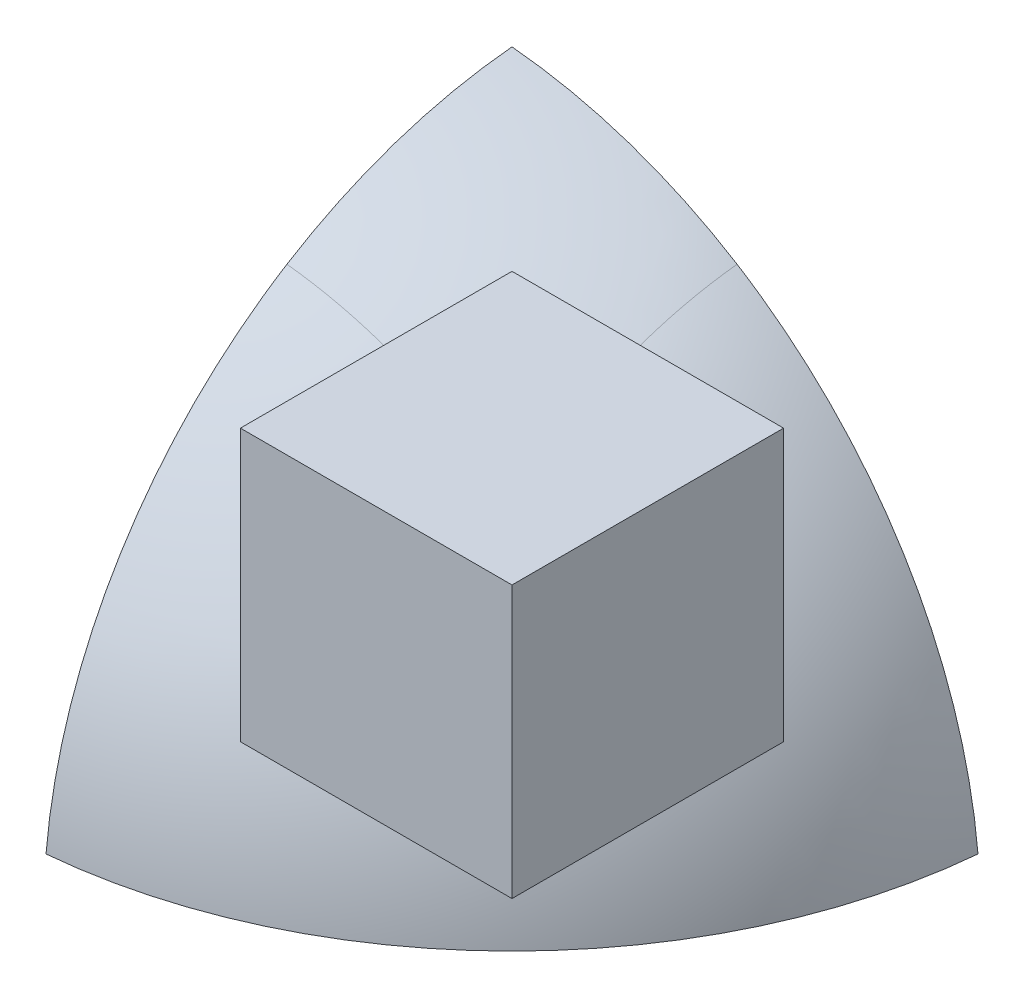
ISO-10303-21;
HEADER;
FILE_DESCRIPTION(('STEP AP214'),'2;1');
FILE_NAME('part.step','',(''),(''),'','','');
FILE_SCHEMA(('AUTOMOTIVE_DESIGN { 1 0 10303 214 1 1 1 1 }'));
ENDSEC;
DATA;
#1=APPLICATION_CONTEXT('core data for automotive mechanical design processes');
#2=APPLICATION_PROTOCOL_DEFINITION('international standard','automotive_design',2000,#1);
#3=PRODUCT_CONTEXT('',#1,'mechanical');
#4=PRODUCT('Part','Part','',(#3));
#5=PRODUCT_RELATED_PRODUCT_CATEGORY('part','',(#4));
#6=PRODUCT_DEFINITION_FORMATION('','',#4);
#7=PRODUCT_DEFINITION_CONTEXT('part definition',#1,'design');
#8=PRODUCT_DEFINITION('design','',#6,#7);
#9=PRODUCT_DEFINITION_SHAPE('','',#8);
#10=(LENGTH_UNIT() NAMED_UNIT(*) SI_UNIT(.MILLI.,.METRE.));
#11=(NAMED_UNIT(*) PLANE_ANGLE_UNIT() SI_UNIT($,.RADIAN.));
#12=(NAMED_UNIT(*) SI_UNIT($,.STERADIAN.) SOLID_ANGLE_UNIT());
#13=UNCERTAINTY_MEASURE_WITH_UNIT(LENGTH_MEASURE(1.E-05),#10,'distance_accuracy_value','');
#14=(GEOMETRIC_REPRESENTATION_CONTEXT(3) GLOBAL_UNCERTAINTY_ASSIGNED_CONTEXT((#13)) GLOBAL_UNIT_ASSIGNED_CONTEXT((#10,
#11,#12)) REPRESENTATION_CONTEXT('',''));
#15=CARTESIAN_POINT('',(0.,0.,0.));
#16=DIRECTION('',(0.,0.,1.));
#17=DIRECTION('',(1.,0.,0.));
#18=AXIS2_PLACEMENT_3D('',#15,#16,#17);
#19=CARTESIAN_POINT('',(23.6228742735545,0.,2.36043317420627));
#20=DIRECTION('',(0.,0.,1.));
#21=DIRECTION('',(0.,-1.,0.));
#22=AXIS2_PLACEMENT_3D('',#19,#20,#21);
#23=PLANE('',#22);
#24=CARTESIAN_POINT('',(0.,0.,2.36043317420627));
#25=DIRECTION('',(0.,0.,1.));
#26=DIRECTION('',(0.,-1.,0.));
#27=AXIS2_PLACEMENT_3D('',#24,#25,#26);
#28=CIRCLE('',#27,23.6228742735545);
#29=CARTESIAN_POINT('',(23.5046494161106,2.36043317420627,2.36043317420628));
#30=VERTEX_POINT('',#29);
#31=CARTESIAN_POINT('',(2.36043317420619,23.5046494161106,2.36043317420635));
#32=VERTEX_POINT('',#31);
#33=EDGE_CURVE('E78',#30,#32,#28,.T.);
#34=ORIENTED_EDGE('',*,*,#33,.T.);
#35=DIRECTION('',(0.,1.,0.));
#36=VECTOR('',#35,1.);
#37=CARTESIAN_POINT('',(2.36043317420627,0.,2.36043317420627));
#38=LINE('',#37,#36);
#39=CARTESIAN_POINT('',(2.36043317420618,25.5231382424998,2.36043317420636));
#40=VERTEX_POINT('',#39);
#41=EDGE_CURVE('E154',#32,#40,#38,.T.);
#42=ORIENTED_EDGE('',*,*,#41,.T.);
#43=CARTESIAN_POINT('',(0.,0.,2.36043317420627));
#44=DIRECTION('',(0.,0.,-1.));
#45=DIRECTION('',(0.,1.,0.));
#46=AXIS2_PLACEMENT_3D('',#43,#44,#45);
#47=CIRCLE('',#46,25.6320547462674);
#48=CARTESIAN_POINT('',(13.5486364278668,21.7586001723716,2.36043317420635));
#49=VERTEX_POINT('',#48);
#50=EDGE_CURVE('E156',#40,#49,#47,.T.);
#51=ORIENTED_EDGE('',*,*,#50,.T.);
#52=CARTESIAN_POINT('',(0.,0.,2.36043317420627));
#53=DIRECTION('',(0.,0.,-1.));
#54=DIRECTION('',(0.,1.,0.));
#55=AXIS2_PLACEMENT_3D('',#52,#53,#54);
#56=CIRCLE('',#55,25.6320547462674);
#57=CARTESIAN_POINT('',(25.5231382424998,2.36043317420627,2.36043317420628));
#58=VERTEX_POINT('',#57);
#59=EDGE_CURVE('E60',#58,#49,#56,.F.);
#60=ORIENTED_EDGE('',*,*,#59,.F.);
#61=DIRECTION('',(-1.,0.,0.));
#62=VECTOR('',#61,1.);
#63=CARTESIAN_POINT('',(25.6320547462674,2.36043317420627,2.36043317420628));
#64=LINE('',#63,#62);
#65=EDGE_CURVE('E142',#58,#30,#64,.T.);
#66=ORIENTED_EDGE('',*,*,#65,.T.);
#67=EDGE_LOOP('',(#34,#42,#51,#60,#66));
#68=FACE_BOUND('',#67,.T.);
#69=ADVANCED_FACE('F41',(#68),#23,.F.);
#70=CARTESIAN_POINT('',(2.36043317420619,23.6228742735545,0.));
#71=DIRECTION('',(1.,0.,0.));
#72=DIRECTION('',(0.,0.,1.));
#73=AXIS2_PLACEMENT_3D('',#70,#71,#72);
#74=PLANE('',#73);
#75=CARTESIAN_POINT('',(2.36043317420627,0.,0.));
#76=DIRECTION('',(1.,0.,0.));
#77=DIRECTION('',(0.,1.,0.));
#78=AXIS2_PLACEMENT_3D('',#75,#76,#77);
#79=CIRCLE('',#78,23.6228742735545);
#80=CARTESIAN_POINT('',(2.36043317420626,2.36043317420627,23.5046494161106));
#81=VERTEX_POINT('',#80);
#82=EDGE_CURVE('E119',#32,#81,#79,.T.);
#83=ORIENTED_EDGE('',*,*,#82,.T.);
#84=DIRECTION('',(0.,0.,1.));
#85=VECTOR('',#84,1.);
#86=CARTESIAN_POINT('',(2.36043317420626,2.36043317420627,0.));
#87=LINE('',#86,#85);
#88=CARTESIAN_POINT('',(2.36043317420626,2.36043317420627,25.5231382424998));
#89=VERTEX_POINT('',#88);
#90=EDGE_CURVE('E127',#81,#89,#87,.T.);
#91=ORIENTED_EDGE('',*,*,#90,.T.);
#92=CARTESIAN_POINT('',(2.36043317420627,0.,0.));
#93=DIRECTION('',(1.,0.,0.));
#94=DIRECTION('',(0.,0.,-1.));
#95=AXIS2_PLACEMENT_3D('',#92,#93,#94);
#96=CIRCLE('',#95,25.6320547462674);
#97=CARTESIAN_POINT('',(2.36043317420619,21.7586001723716,13.5486364278669));
#98=VERTEX_POINT('',#97);
#99=EDGE_CURVE('E122',#98,#89,#96,.T.);
#100=ORIENTED_EDGE('',*,*,#99,.F.);
#101=CARTESIAN_POINT('',(2.36043317420627,0.,0.));
#102=DIRECTION('',(1.,0.,0.));
#103=DIRECTION('',(0.,1.,0.));
#104=AXIS2_PLACEMENT_3D('',#101,#102,#103);
#105=CIRCLE('',#104,25.6320547462674);
#106=EDGE_CURVE('E158',#98,#40,#105,.F.);
#107=ORIENTED_EDGE('',*,*,#106,.T.);
#108=ORIENTED_EDGE('',*,*,#41,.F.);
#109=EDGE_LOOP('',(#83,#91,#100,#107,#108));
#110=FACE_BOUND('',#109,.T.);
#111=ADVANCED_FACE('F251',(#110),#74,.F.);
#112=CARTESIAN_POINT('',(27.6399036193533,2.36043317420627,0.));
#113=DIRECTION('',(0.,-1.,0.));
#114=DIRECTION('',(0.,0.,-1.));
#115=AXIS2_PLACEMENT_3D('',#112,#113,#114);
#116=PLANE('',#115);
#117=CARTESIAN_POINT('',(0.,2.36043317420627,0.));
#118=DIRECTION('',(0.,-1.,0.));
#119=DIRECTION('',(0.,0.,-1.));
#120=AXIS2_PLACEMENT_3D('',#117,#118,#119);
#121=CIRCLE('',#120,23.6228742735545);
#122=EDGE_CURVE('E98',#30,#81,#121,.T.);
#123=ORIENTED_EDGE('',*,*,#122,.F.);
#124=ORIENTED_EDGE('',*,*,#65,.F.);
#125=CARTESIAN_POINT('',(0.,2.36043317420627,0.));
#126=DIRECTION('',(0.,-1.,0.));
#127=DIRECTION('',(0.,0.,-1.));
#128=AXIS2_PLACEMENT_3D('',#125,#126,#127);
#129=CIRCLE('',#128,25.6320547462674);
#130=EDGE_CURVE('E108',#58,#89,#129,.T.);
#131=ORIENTED_EDGE('',*,*,#130,.T.);
#132=ORIENTED_EDGE('',*,*,#90,.F.);
#133=EDGE_LOOP('',(#123,#124,#131,#132));
#134=FACE_BOUND('',#133,.T.);
#135=ADVANCED_FACE('F250',(#134),#116,.T.);
#136=CARTESIAN_POINT('',(0.,0.,0.));
#137=DIRECTION('',(0.,-1.,0.));
#138=DIRECTION('',(1.,0.,0.));
#139=AXIS2_PLACEMENT_3D('',#136,#137,#138);
#140=SPHERICAL_SURFACE('',#139,25.7405103928719);
#141=ORIENTED_EDGE('',*,*,#59,.T.);
#142=CARTESIAN_POINT('',(13.5486364278669,0.,0.));
#143=DIRECTION('',(1.,0.,0.));
#144=DIRECTION('',(0.,0.,-1.));
#145=AXIS2_PLACEMENT_3D('',#142,#143,#144);
#146=CIRCLE('',#145,21.8862588450156);
#147=CARTESIAN_POINT('',(13.5486364278668,17.188448946211,13.5486364278669));
#148=VERTEX_POINT('',#147);
#149=EDGE_CURVE('E131',#49,#148,#146,.T.);
#150=ORIENTED_EDGE('',*,*,#149,.T.);
#151=CARTESIAN_POINT('',(0.,0.,13.5486364278669));
#152=DIRECTION('',(0.,0.,-1.));
#153=DIRECTION('',(0.,1.,0.));
#154=AXIS2_PLACEMENT_3D('',#151,#152,#153);
#155=CIRCLE('',#154,21.8862588450156);
#156=CARTESIAN_POINT('',(17.188448946211,13.5486364278669,13.5486364278669));
#157=VERTEX_POINT('',#156);
#158=EDGE_CURVE('E133',#148,#157,#155,.T.);
#159=ORIENTED_EDGE('',*,*,#158,.T.);
#160=CARTESIAN_POINT('',(0.,13.5486364278669,0.));
#161=DIRECTION('',(0.,-1.,0.));
#162=DIRECTION('',(0.,0.,-1.));
#163=AXIS2_PLACEMENT_3D('',#160,#161,#162);
#164=CIRCLE('',#163,21.8862588450156);
#165=CARTESIAN_POINT('',(13.5486364278668,13.5486364278669,17.188448946211));
#166=VERTEX_POINT('',#165);
#167=EDGE_CURVE('E137',#157,#166,#164,.T.);
#168=ORIENTED_EDGE('',*,*,#167,.T.);
#169=EDGE_CURVE('E51',#148,#166,#146,.T.);
#170=ORIENTED_EDGE('',*,*,#169,.F.);
#171=EDGE_CURVE('E117',#98,#148,#155,.T.);
#172=ORIENTED_EDGE('',*,*,#171,.F.);
#173=ORIENTED_EDGE('',*,*,#99,.T.);
#174=ORIENTED_EDGE('',*,*,#130,.F.);
#175=EDGE_LOOP('',(#141,#150,#159,#168,#170,#172,#173,#174));
#176=FACE_BOUND('',#175,.T.);
#177=ADVANCED_FACE('F213',(#176),#140,.T.);
#178=CARTESIAN_POINT('',(0.,0.,0.));
#179=DIRECTION('',(0.,0.,-1.));
#180=DIRECTION('',(1.,0.,0.));
#181=AXIS2_PLACEMENT_3D('',#178,#179,#180);
#182=SPHERICAL_SURFACE('',#181,25.7405103928719);
#183=ORIENTED_EDGE('',*,*,#149,.F.);
#184=ORIENTED_EDGE('',*,*,#50,.F.);
#185=ORIENTED_EDGE('',*,*,#106,.F.);
#186=ORIENTED_EDGE('',*,*,#171,.T.);
#187=EDGE_LOOP('',(#183,#184,#185,#186));
#188=FACE_BOUND('',#187,.T.);
#189=ADVANCED_FACE('F221',(#188),#182,.T.);
#190=CARTESIAN_POINT('',(32.4999999999999,19.5000000000001,0.));
#191=DIRECTION('',(0.,-1.,0.));
#192=DIRECTION('',(0.,0.,-1.));
#193=AXIS2_PLACEMENT_3D('',#190,#191,#192);
#194=PLANE('',#193);
#195=DIRECTION('',(0.,0.,-1.));
#196=VECTOR('',#195,1.);
#197=CARTESIAN_POINT('',(33.,19.5000000000001,-33.));
#198=LINE('',#197,#196);
#199=CARTESIAN_POINT('',(33.,19.5000000000001,33.));
#200=VERTEX_POINT('',#199);
#201=CARTESIAN_POINT('',(33.,19.5,19.5000000000001));
#202=VERTEX_POINT('',#201);
#203=EDGE_CURVE('E186',#200,#202,#198,.T.);
#204=ORIENTED_EDGE('',*,*,#203,.F.);
#205=DIRECTION('',(-1.,0.,0.));
#206=VECTOR('',#205,1.);
#207=CARTESIAN_POINT('',(0.,19.5000000000001,33.));
#208=LINE('',#207,#206);
#209=CARTESIAN_POINT('',(19.5,19.5000000000001,33.));
#210=VERTEX_POINT('',#209);
#211=EDGE_CURVE('E107',#200,#210,#208,.T.);
#212=ORIENTED_EDGE('',*,*,#211,.T.);
#213=DIRECTION('',(0.,0.,-1.));
#214=VECTOR('',#213,1.);
#215=CARTESIAN_POINT('',(19.5,19.5000000000001,0.));
#216=LINE('',#215,#214);
#217=CARTESIAN_POINT('',(19.5,19.5,24.7386337537059));
#218=VERTEX_POINT('',#217);
#219=EDGE_CURVE('E150',#210,#218,#216,.T.);
#220=ORIENTED_EDGE('',*,*,#219,.T.);
#221=CARTESIAN_POINT('',(0.,19.5,0.));
#222=DIRECTION('',(0.,-1.,0.));
#223=DIRECTION('',(0.,0.,-1.));
#224=AXIS2_PLACEMENT_3D('',#221,#222,#223);
#225=CIRCLE('',#224,31.4999999999999);
#226=CARTESIAN_POINT('',(24.7386337537058,19.5,19.5000000000001));
#227=VERTEX_POINT('',#226);
#228=EDGE_CURVE('E134',#227,#218,#225,.T.);
#229=ORIENTED_EDGE('',*,*,#228,.F.);
#230=DIRECTION('',(1.,0.,0.));
#231=VECTOR('',#230,1.);
#232=CARTESIAN_POINT('',(32.4999999999999,19.5000000000001,19.5000000000001));
#233=LINE('',#232,#231);
#234=EDGE_CURVE('E151',#227,#202,#233,.T.);
#235=ORIENTED_EDGE('',*,*,#234,.T.);
#236=EDGE_LOOP('',(#204,#212,#220,#229,#235));
#237=FACE_BOUND('',#236,.T.);
#238=ADVANCED_FACE('F197',(#237),#194,.T.);
#239=CARTESIAN_POINT('',(19.4999999999999,32.5,0.));
#240=DIRECTION('',(-1.,0.,0.));
#241=DIRECTION('',(0.,0.,-1.));
#242=AXIS2_PLACEMENT_3D('',#239,#240,#241);
#243=PLANE('',#242);
#244=DIRECTION('',(0.,0.,1.));
#245=VECTOR('',#244,1.);
#246=CARTESIAN_POINT('',(19.4999999999999,33.,-33.));
#247=LINE('',#246,#245);
#248=CARTESIAN_POINT('',(19.5,33.,19.5000000000002));
#249=VERTEX_POINT('',#248);
#250=CARTESIAN_POINT('',(19.5,33.,33.));
#251=VERTEX_POINT('',#250);
#252=EDGE_CURVE('E112',#249,#251,#247,.T.);
#253=ORIENTED_EDGE('',*,*,#252,.F.);
#254=DIRECTION('',(0.,1.,0.));
#255=VECTOR('',#254,1.);
#256=CARTESIAN_POINT('',(19.5000000000001,-1.13473143512402E-13,19.5000000000001));
#257=LINE('',#256,#255);
#258=CARTESIAN_POINT('',(19.5,24.7386337537058,19.5000000000001));
#259=VERTEX_POINT('',#258);
#260=EDGE_CURVE('E169',#259,#249,#257,.T.);
#261=ORIENTED_EDGE('',*,*,#260,.F.);
#262=CARTESIAN_POINT('',(19.5,0.,0.));
#263=DIRECTION('',(1.,0.,0.));
#264=DIRECTION('',(0.,0.,-1.));
#265=AXIS2_PLACEMENT_3D('',#262,#263,#264);
#266=CIRCLE('',#265,31.4999999999999);
#267=EDGE_CURVE('E11',#259,#218,#266,.T.);
#268=ORIENTED_EDGE('',*,*,#267,.T.);
#269=ORIENTED_EDGE('',*,*,#219,.F.);
#270=DIRECTION('',(0.,1.,0.));
#271=VECTOR('',#270,1.);
#272=CARTESIAN_POINT('',(19.5000000000001,0.,33.));
#273=LINE('',#272,#271);
#274=EDGE_CURVE('E185',#210,#251,#273,.T.);
#275=ORIENTED_EDGE('',*,*,#274,.T.);
#276=EDGE_LOOP('',(#253,#261,#268,#269,#275));
#277=FACE_BOUND('',#276,.T.);
#278=ADVANCED_FACE('F268',(#277),#243,.T.);
#279=CARTESIAN_POINT('',(0.,13.5486364278669,0.));
#280=DIRECTION('',(0.,1.,0.));
#281=DIRECTION('',(0.,0.,1.));
#282=AXIS2_PLACEMENT_3D('',#279,#280,#281);
#283=CONICAL_SURFACE('',#282,21.8862588450156,1.01648883059334);
#284=ORIENTED_EDGE('',*,*,#228,.T.);
#285=DIRECTION('',(0.526354614616295,0.526354614616297,0.667758668490542));
#286=VECTOR('',#285,1.);
#287=CARTESIAN_POINT('',(0.,0.,0.));
#288=LINE('',#287,#286);
#289=EDGE_CURVE('E146',#218,#166,#288,.F.);
#290=ORIENTED_EDGE('',*,*,#289,.T.);
#291=ORIENTED_EDGE('',*,*,#167,.F.);
#292=DIRECTION('',(0.667758668490539,0.526354614616297,0.526354614616299));
#293=VECTOR('',#292,1.);
#294=CARTESIAN_POINT('',(0.,0.,0.));
#295=LINE('',#294,#293);
#296=EDGE_CURVE('E147',#157,#227,#295,.T.);
#297=ORIENTED_EDGE('',*,*,#296,.T.);
#298=EDGE_LOOP('',(#284,#290,#291,#297));
#299=FACE_BOUND('',#298,.T.);
#300=ADVANCED_FACE('F208',(#299),#283,.T.);
#301=CARTESIAN_POINT('',(32.4999999999999,0.,19.5000000000001));
#302=DIRECTION('',(0.,0.,-1.));
#303=DIRECTION('',(0.,1.,0.));
#304=AXIS2_PLACEMENT_3D('',#301,#302,#303);
#305=PLANE('',#304);
#306=DIRECTION('',(0.,1.,0.));
#307=VECTOR('',#306,1.);
#308=CARTESIAN_POINT('',(33.,-33.0000000000002,19.4999999999999));
#309=LINE('',#308,#307);
#310=CARTESIAN_POINT('',(33.,33.,19.5000000000002));
#311=VERTEX_POINT('',#310);
#312=EDGE_CURVE('E93',#202,#311,#309,.T.);
#313=ORIENTED_EDGE('',*,*,#312,.F.);
#314=ORIENTED_EDGE('',*,*,#234,.F.);
#315=CARTESIAN_POINT('',(0.,0.,19.5));
#316=DIRECTION('',(0.,0.,-1.));
#317=DIRECTION('',(0.,1.,0.));
#318=AXIS2_PLACEMENT_3D('',#315,#316,#317);
#319=CIRCLE('',#318,31.4999999999999);
#320=EDGE_CURVE('E126',#259,#227,#319,.T.);
#321=ORIENTED_EDGE('',*,*,#320,.F.);
#322=ORIENTED_EDGE('',*,*,#260,.T.);
#323=DIRECTION('',(-1.,0.,0.));
#324=VECTOR('',#323,1.);
#325=CARTESIAN_POINT('',(-33.,33.,19.5000000000002));
#326=LINE('',#325,#324);
#327=EDGE_CURVE('E182',#311,#249,#326,.T.);
#328=ORIENTED_EDGE('',*,*,#327,.F.);
#329=EDGE_LOOP('',(#313,#314,#321,#322,#328));
#330=FACE_BOUND('',#329,.T.);
#331=ADVANCED_FACE('F239',(#330),#305,.T.);
#332=CARTESIAN_POINT('',(13.5486364278669,0.,0.));
#333=DIRECTION('',(1.,0.,0.));
#334=DIRECTION('',(0.,0.,1.));
#335=AXIS2_PLACEMENT_3D('',#332,#333,#334);
#336=CONICAL_SURFACE('',#335,21.8862588450156,1.01648883059334);
#337=ORIENTED_EDGE('',*,*,#289,.F.);
#338=ORIENTED_EDGE('',*,*,#267,.F.);
#339=DIRECTION('',(0.526354614616295,0.66775866849054,0.526354614616299));
#340=VECTOR('',#339,1.);
#341=CARTESIAN_POINT('',(0.,0.,0.));
#342=LINE('',#341,#340);
#343=EDGE_CURVE('E45',#148,#259,#342,.T.);
#344=ORIENTED_EDGE('',*,*,#343,.F.);
#345=ORIENTED_EDGE('',*,*,#169,.T.);
#346=EDGE_LOOP('',(#337,#338,#344,#345));
#347=FACE_BOUND('',#346,.T.);
#348=ADVANCED_FACE('F203',(#347),#336,.T.);
#349=CARTESIAN_POINT('',(0.,0.,13.5486364278669));
#350=DIRECTION('',(0.,0.,1.));
#351=DIRECTION('',(0.,-1.,0.));
#352=AXIS2_PLACEMENT_3D('',#349,#350,#351);
#353=CONICAL_SURFACE('',#352,21.8862588450156,1.01648883059334);
#354=ORIENTED_EDGE('',*,*,#296,.F.);
#355=ORIENTED_EDGE('',*,*,#158,.F.);
#356=ORIENTED_EDGE('',*,*,#343,.T.);
#357=ORIENTED_EDGE('',*,*,#320,.T.);
#358=EDGE_LOOP('',(#354,#355,#356,#357));
#359=FACE_BOUND('',#358,.T.);
#360=ADVANCED_FACE('F265',(#359),#353,.T.);
#361=CARTESIAN_POINT('',(0.,0.,0.));
#362=DIRECTION('',(-1.,0.,0.));
#363=DIRECTION('',(0.,1.,0.));
#364=AXIS2_PLACEMENT_3D('',#361,#362,#363);
#365=SPHERICAL_SURFACE('',#364,23.7405103928718);
#366=ORIENTED_EDGE('',*,*,#82,.F.);
#367=ORIENTED_EDGE('',*,*,#33,.F.);
#368=ORIENTED_EDGE('',*,*,#122,.T.);
#369=EDGE_LOOP('',(#366,#367,#368));
#370=FACE_BOUND('',#369,.T.);
#371=ADVANCED_FACE('F247',(#370),#365,.F.);
#372=CARTESIAN_POINT('',(-33.,33.,-33.));
#373=DIRECTION('',(0.,1.,0.));
#374=DIRECTION('',(0.,0.,1.));
#375=AXIS2_PLACEMENT_3D('',#372,#373,#374);
#376=PLANE('',#375);
#377=DIRECTION('',(0.,0.,1.));
#378=VECTOR('',#377,1.);
#379=CARTESIAN_POINT('',(33.,33.,-33.));
#380=LINE('',#379,#378);
#381=CARTESIAN_POINT('',(33.,33.,33.));
#382=VERTEX_POINT('',#381);
#383=EDGE_CURVE('E85',#311,#382,#380,.T.);
#384=ORIENTED_EDGE('',*,*,#383,.F.);
#385=ORIENTED_EDGE('',*,*,#327,.T.);
#386=ORIENTED_EDGE('',*,*,#252,.T.);
#387=DIRECTION('',(-1.,0.,0.));
#388=VECTOR('',#387,1.);
#389=CARTESIAN_POINT('',(-33.,33.,33.));
#390=LINE('',#389,#388);
#391=EDGE_CURVE('E97',#382,#251,#390,.T.);
#392=ORIENTED_EDGE('',*,*,#391,.F.);
#393=EDGE_LOOP('',(#384,#385,#386,#392));
#394=FACE_BOUND('',#393,.T.);
#395=ADVANCED_FACE('F110',(#394),#376,.T.);
#396=CARTESIAN_POINT('',(33.,-33.,-33.));
#397=DIRECTION('',(1.,0.,0.));
#398=DIRECTION('',(0.,0.,-1.));
#399=AXIS2_PLACEMENT_3D('',#396,#397,#398);
#400=PLANE('',#399);
#401=ORIENTED_EDGE('',*,*,#203,.T.);
#402=ORIENTED_EDGE('',*,*,#312,.T.);
#403=ORIENTED_EDGE('',*,*,#383,.T.);
#404=DIRECTION('',(0.,1.,0.));
#405=VECTOR('',#404,1.);
#406=CARTESIAN_POINT('',(33.,-33.,33.));
#407=LINE('',#406,#405);
#408=EDGE_CURVE('E90',#200,#382,#407,.T.);
#409=ORIENTED_EDGE('',*,*,#408,.F.);
#410=EDGE_LOOP('',(#401,#402,#403,#409));
#411=FACE_BOUND('',#410,.T.);
#412=ADVANCED_FACE('F88',(#411),#400,.T.);
#413=CARTESIAN_POINT('',(0.,0.,33.));
#414=DIRECTION('',(0.,0.,-1.));
#415=DIRECTION('',(-1.,0.,0.));
#416=AXIS2_PLACEMENT_3D('',#413,#414,#415);
#417=PLANE('',#416);
#418=ORIENTED_EDGE('',*,*,#274,.F.);
#419=ORIENTED_EDGE('',*,*,#211,.F.);
#420=ORIENTED_EDGE('',*,*,#408,.T.);
#421=ORIENTED_EDGE('',*,*,#391,.T.);
#422=EDGE_LOOP('',(#418,#419,#420,#421));
#423=FACE_BOUND('',#422,.T.);
#424=ADVANCED_FACE('F43',(#423),#417,.F.);
#425=CLOSED_SHELL('',(#69,#111,#135,#177,#189,#238,#278,#300,#331,#348,#360,#371,#395,#412,#424));
#426=MANIFOLD_SOLID_BREP('B2',#425);
#427=ADVANCED_BREP_SHAPE_REPRESENTATION('',(#18,#426),#14);
#428=SHAPE_DEFINITION_REPRESENTATION(#9,#427);
ENDSEC;
END-ISO-10303-21;
